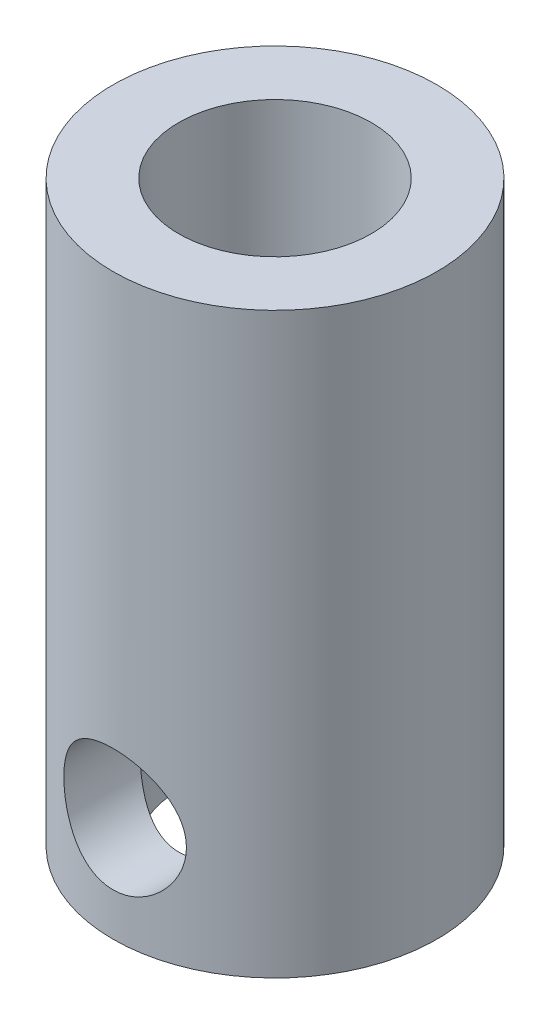
ISO-10303-21;
HEADER;
FILE_DESCRIPTION(('STEP AP214'),'2;1');
FILE_NAME('part.step','',(''),(''),'','','');
FILE_SCHEMA(('AUTOMOTIVE_DESIGN { 1 0 10303 214 1 1 1 1 }'));
ENDSEC;
DATA;
#1=APPLICATION_CONTEXT('core data for automotive mechanical design processes');
#2=APPLICATION_PROTOCOL_DEFINITION('international standard','automotive_design',2000,#1);
#3=PRODUCT_CONTEXT('',#1,'mechanical');
#4=PRODUCT('Part','Part','',(#3));
#5=PRODUCT_RELATED_PRODUCT_CATEGORY('part','',(#4));
#6=PRODUCT_DEFINITION_FORMATION('','',#4);
#7=PRODUCT_DEFINITION_CONTEXT('part definition',#1,'design');
#8=PRODUCT_DEFINITION('design','',#6,#7);
#9=PRODUCT_DEFINITION_SHAPE('','',#8);
#10=(LENGTH_UNIT() NAMED_UNIT(*) SI_UNIT(.MILLI.,.METRE.));
#11=(NAMED_UNIT(*) PLANE_ANGLE_UNIT() SI_UNIT($,.RADIAN.));
#12=(NAMED_UNIT(*) SI_UNIT($,.STERADIAN.) SOLID_ANGLE_UNIT());
#13=UNCERTAINTY_MEASURE_WITH_UNIT(LENGTH_MEASURE(1.E-05),#10,'distance_accuracy_value','');
#14=(GEOMETRIC_REPRESENTATION_CONTEXT(3) GLOBAL_UNCERTAINTY_ASSIGNED_CONTEXT((#13)) GLOBAL_UNIT_ASSIGNED_CONTEXT((#10,
#11,#12)) REPRESENTATION_CONTEXT('',''));
#15=CARTESIAN_POINT('',(0.,0.,0.));
#16=DIRECTION('',(0.,0.,1.));
#17=DIRECTION('',(1.,0.,0.));
#18=AXIS2_PLACEMENT_3D('',#15,#16,#17);
#19=CARTESIAN_POINT('',(0.,19.05,0.));
#20=DIRECTION('',(0.,-1.,0.));
#21=DIRECTION('',(0.,0.,-1.));
#22=AXIS2_PLACEMENT_3D('',#19,#20,#21);
#23=CYLINDRICAL_SURFACE('',#22,5.334);
#24=CARTESIAN_POINT('',(2.01929999999999,3.429,4.93700146951568));
#25=CARTESIAN_POINT('',(2.01930447944565,3.53796644205671,4.93699724405046));
#26=CARTESIAN_POINT('',(2.01045059439056,3.64690370553361,4.94064814854933));
#27=CARTESIAN_POINT('',(1.97543444054489,3.86148882864372,4.95475201963925));
#28=CARTESIAN_POINT('',(1.94927294682313,3.96713683535452,4.96520468163385));
#29=CARTESIAN_POINT('',(1.88074304619809,4.17198278347489,4.99156194094386));
#30=CARTESIAN_POINT('',(1.83841414033231,4.2711957615293,5.00745324054417));
#31=CARTESIAN_POINT('',(1.73889128334471,4.46115102344321,5.04287560500619));
#32=CARTESIAN_POINT('',(1.6816927775262,4.55189070025616,5.06240778458365));
#33=CARTESIAN_POINT('',(1.55095007886271,4.7269220295397,5.1040199433203));
#34=CARTESIAN_POINT('',(1.47677408325426,4.81072382075372,5.12617585427608));
#35=CARTESIAN_POINT('',(1.31552180232293,4.96504478705856,5.16990629793248));
#36=CARTESIAN_POINT('',(1.22844270450761,5.0355610586704,5.19148070266726));
#37=CARTESIAN_POINT('',(1.04012523794396,5.16368183766763,5.23252204526852));
#38=CARTESIAN_POINT('',(0.938499803257828,5.22075210244006,5.25188961400418));
#39=CARTESIAN_POINT('',(0.726227423158126,5.31678227445568,5.28542063488425));
#40=CARTESIAN_POINT('',(0.615583687488662,5.35574859235797,5.29958592879611));
#41=CARTESIAN_POINT('',(0.393566749542693,5.41274137724498,5.32057718322424));
#42=CARTESIAN_POINT('',(0.282438553669896,5.43161158643117,5.32769789450095));
#43=CARTESIAN_POINT('',(0.0583798398278732,5.45058184692518,5.33485652895422));
#44=CARTESIAN_POINT('',(-0.0545500684528995,5.45068811853213,5.33489679931724));
#45=CARTESIAN_POINT('',(-0.272951762873949,5.43261481136873,5.32807636219454));
#46=CARTESIAN_POINT('',(-0.378512558081566,5.41535666378981,5.32156339727964));
#47=CARTESIAN_POINT('',(-0.585111251091155,5.36459681820008,5.30282614548131));
#48=CARTESIAN_POINT('',(-0.686148827388547,5.33109396753274,5.29060145331974));
#49=CARTESIAN_POINT('',(-0.882591199788239,5.24837714092317,5.26142589156488));
#50=CARTESIAN_POINT('',(-0.977891853376849,5.19894029486581,5.24440843901689));
#51=CARTESIAN_POINT('',(-1.15908281530852,5.08595760716204,5.20736477295068));
#52=CARTESIAN_POINT('',(-1.24497004337341,5.02240716770396,5.18733757963256));
#53=CARTESIAN_POINT('',(-1.41031734945089,4.87858128309122,5.14492730665769));
#54=CARTESIAN_POINT('',(-1.48909060289719,4.79753549367529,5.12247495361345));
#55=CARTESIAN_POINT('',(-1.63218972233639,4.62325577623301,5.07869327063848));
#56=CARTESIAN_POINT('',(-1.69651181554814,4.53001867543433,5.05736423508365));
#57=CARTESIAN_POINT('',(-1.81023010786301,4.33124303399592,5.01780263958016));
#58=CARTESIAN_POINT('',(-1.85924901990288,4.22547089829707,4.99965257367589));
#59=CARTESIAN_POINT('',(-1.93851753880741,4.00630460921826,4.96945937974622));
#60=CARTESIAN_POINT('',(-1.96877783080307,3.89291483581017,4.95741277583277));
#61=CARTESIAN_POINT('',(-2.0080927254921,3.66852916571396,4.94161372576153));
#62=CARTESIAN_POINT('',(-2.01824049485177,3.55775511724918,4.93743437273379));
#63=CARTESIAN_POINT('',(-2.02020093934924,3.33603239846786,4.93663342024542));
#64=CARTESIAN_POINT('',(-2.01201832383527,3.22508378031911,4.94000987958409));
#65=CARTESIAN_POINT('',(-1.97854205652086,3.01183186914766,4.95350589275915));
#66=CARTESIAN_POINT('',(-1.95410194104481,2.90937078397479,4.96328872527596));
#67=CARTESIAN_POINT('',(-1.88988298600506,2.71005348440488,4.98809328378995));
#68=CARTESIAN_POINT('',(-1.85010096750629,2.61319843639933,5.00311609548081));
#69=CARTESIAN_POINT('',(-1.75463072385412,2.42375373533398,5.03740860205377));
#70=CARTESIAN_POINT('',(-1.69839621410485,2.3314653892027,5.05681781536739));
#71=CARTESIAN_POINT('',(-1.57219523321136,2.15724747101338,5.09746480725639));
#72=CARTESIAN_POINT('',(-1.50222365366067,2.07532177120689,5.11870326441882));
#73=CARTESIAN_POINT('',(-1.34516894631352,1.91864380219287,5.16227937258415));
#74=CARTESIAN_POINT('',(-1.25727058071108,1.84470087388889,5.18459902436317));
#75=CARTESIAN_POINT('',(-1.06976739053702,1.71251372859965,5.22650650196036));
#76=CARTESIAN_POINT('',(-0.970162473418255,1.65426963573486,5.24609430617899));
#77=CARTESIAN_POINT('',(-0.762084546055994,1.55549649159357,5.28032694944767));
#78=CARTESIAN_POINT('',(-0.653639678197281,1.51491364331945,5.29498676788628));
#79=CARTESIAN_POINT('',(-0.430779322695875,1.45280032542776,5.31775366325145));
#80=CARTESIAN_POINT('',(-0.316366729446474,1.43126070903253,5.32586388589443));
#81=CARTESIAN_POINT('',(-0.0921269840688139,1.40884562792458,5.33431446661301));
#82=CARTESIAN_POINT('',(0.0175700260696672,1.40682107157147,5.33508685186249));
#83=CARTESIAN_POINT('',(0.235675890355791,1.42052681410102,5.32990684279753));
#84=CARTESIAN_POINT('',(0.344084903230242,1.43625490180729,5.32395528598201));
#85=CARTESIAN_POINT('',(0.553754325491232,1.48421010250464,5.3061959436016));
#86=CARTESIAN_POINT('',(0.65512610504446,1.5160107376975,5.29453976881732));
#87=CARTESIAN_POINT('',(0.851099804673821,1.594780504935,5.26659215506921));
#88=CARTESIAN_POINT('',(0.945700438435498,1.64175250979098,5.2502998382871));
#89=CARTESIAN_POINT('',(1.12984126460486,1.75179421046231,5.21384686801513));
#90=CARTESIAN_POINT('',(1.21899691290268,1.81546192263802,5.19355150342232));
#91=CARTESIAN_POINT('',(1.38571137675006,1.9561510808879,5.15157869080139));
#92=CARTESIAN_POINT('',(1.46326600313846,2.03317732918966,5.1299007475314));
#93=CARTESIAN_POINT('',(1.60889417238222,2.20334295835456,5.08616858438968));
#94=CARTESIAN_POINT('',(1.67622898493519,2.29712810269221,5.06415732477682));
#95=CARTESIAN_POINT('',(1.79422016325732,2.49537615296483,5.02356822261871));
#96=CARTESIAN_POINT('',(1.84487417660335,2.59984056223187,5.0049908645041));
#97=CARTESIAN_POINT('',(1.92989734602869,2.82239312636753,4.97285117373348));
#98=CARTESIAN_POINT('',(1.96328114135574,2.94090744590317,4.9596003647767));
#99=CARTESIAN_POINT('',(2.00797225124147,3.18262915575414,4.94168088836879));
#100=CARTESIAN_POINT('',(2.01929493679981,3.30583321744351,4.93700624563709));
#101=CARTESIAN_POINT('',(2.01929999999999,3.429,4.93700146951568));
#102=B_SPLINE_CURVE_WITH_KNOTS('',3,(#24,#25,#26,#27,#28,#29,#30,#31,#32,#33,#34,#35,#36,#37,
#38,#39,#40,#41,#42,#43,#44,#45,#46,#47,#48,#49,#50,#51,#52,#53,#54,#55,#56,#57,#58,#59,#60,#61,
#62,#63,#64,#65,#66,#67,#68,#69,#70,#71,#72,#73,#74,#75,#76,#77,#78,#79,#80,#81,#82,#83,#84,#85,
#86,#87,#88,#89,#90,#91,#92,#93,#94,#95,#96,#97,#98,#99,#100,#101),.UNSPECIFIED.,.T.,.F.,(4,2,2,
2,2,2,2,2,2,2,2,2,2,2,2,2,2,2,2,2,2,2,2,2,2,2,2,2,2,2,2,2,2,2,2,2,2,2,4),(0.,0.326440462933104,
0.652866308208239,0.97849966296616,1.30423288001533,1.64497726295524,1.98579602758814,
2.33846601182069,2.69101101924979,3.02808777213957,3.36505278290879,3.68503301877184,
4.00503596242417,4.32972461584071,4.65451919925019,4.99864582719999,5.34286219255829,
5.69499486283584,6.0469267694459,6.37913973630183,6.71126736249901,7.02720512429604,
7.34320838551137,7.6712024554679,7.99931872846167,8.3487060328166,8.69809609946859,
9.04641432838319,9.39456516328478,9.72208120206034,10.0495564516543,10.3687657960398,
10.6880356205532,11.0208403418839,11.3537649513074,11.7046787209908,12.0556419573988,
12.4248810015916,12.793862687667),.UNSPECIFIED.);
#103=CARTESIAN_POINT('',(2.01929999999999,3.429,4.93700146951568));
#104=VERTEX_POINT('',#103);
#105=EDGE_CURVE('E52',#104,#104,#102,.T.);
#106=ORIENTED_EDGE('',*,*,#105,.F.);
#107=EDGE_LOOP('',(#106));
#108=FACE_BOUND('',#107,.T.);
#109=CARTESIAN_POINT('',(0.,19.05,0.));
#110=DIRECTION('',(0.,-1.,0.));
#111=DIRECTION('',(0.,0.,-1.));
#112=AXIS2_PLACEMENT_3D('',#109,#110,#111);
#113=CIRCLE('',#112,5.334);
#114=CARTESIAN_POINT('',(0.,19.05,-5.334));
#115=VERTEX_POINT('',#114);
#116=EDGE_CURVE('E10',#115,#115,#113,.T.);
#117=ORIENTED_EDGE('',*,*,#116,.T.);
#118=EDGE_LOOP('',(#117));
#119=FACE_BOUND('',#118,.T.);
#120=CARTESIAN_POINT('',(0.,0.,0.));
#121=DIRECTION('',(0.,-1.,0.));
#122=DIRECTION('',(0.,0.,-1.));
#123=AXIS2_PLACEMENT_3D('',#120,#121,#122);
#124=CIRCLE('',#123,5.334);
#125=CARTESIAN_POINT('',(0.,0.,-5.334));
#126=VERTEX_POINT('',#125);
#127=EDGE_CURVE('E39',#126,#126,#124,.T.);
#128=ORIENTED_EDGE('',*,*,#127,.F.);
#129=EDGE_LOOP('',(#128));
#130=FACE_BOUND('',#129,.T.);
#131=ADVANCED_FACE('F32',(#108,#119,#130),#23,.T.);
#132=CARTESIAN_POINT('',(5.334,19.05,0.));
#133=DIRECTION('',(0.,1.,0.));
#134=DIRECTION('',(0.,0.,1.));
#135=AXIS2_PLACEMENT_3D('',#132,#133,#134);
#136=PLANE('',#135);
#137=CARTESIAN_POINT('',(0.,19.05,0.));
#138=DIRECTION('',(0.,-1.,0.));
#139=DIRECTION('',(0.,0.,-1.));
#140=AXIS2_PLACEMENT_3D('',#137,#138,#139);
#141=CIRCLE('',#140,3.17499999999998);
#142=CARTESIAN_POINT('',(0.,19.05,-3.17499999999998));
#143=VERTEX_POINT('',#142);
#144=EDGE_CURVE('E43',#143,#143,#141,.T.);
#145=ORIENTED_EDGE('',*,*,#144,.T.);
#146=EDGE_LOOP('',(#145));
#147=FACE_BOUND('',#146,.T.);
#148=ORIENTED_EDGE('',*,*,#116,.F.);
#149=EDGE_LOOP('',(#148));
#150=FACE_BOUND('',#149,.T.);
#151=ADVANCED_FACE('F77',(#147,#150),#136,.T.);
#152=CARTESIAN_POINT('',(0.,0.,0.));
#153=DIRECTION('',(0.,-1.,0.));
#154=DIRECTION('',(0.,0.,-1.));
#155=AXIS2_PLACEMENT_3D('',#152,#153,#154);
#156=PLANE('',#155);
#157=CARTESIAN_POINT('',(0.,0.,0.));
#158=DIRECTION('',(0.,-1.,0.));
#159=DIRECTION('',(0.,0.,-1.));
#160=AXIS2_PLACEMENT_3D('',#157,#158,#159);
#161=CIRCLE('',#160,3.17499999999998);
#162=CARTESIAN_POINT('',(0.,0.,-3.17499999999998));
#163=VERTEX_POINT('',#162);
#164=EDGE_CURVE('E47',#163,#163,#161,.T.);
#165=ORIENTED_EDGE('',*,*,#164,.F.);
#166=EDGE_LOOP('',(#165));
#167=FACE_BOUND('',#166,.T.);
#168=ORIENTED_EDGE('',*,*,#127,.T.);
#169=EDGE_LOOP('',(#168));
#170=FACE_BOUND('',#169,.T.);
#171=ADVANCED_FACE('F74',(#167,#170),#156,.T.);
#172=CARTESIAN_POINT('',(0.,0.,0.));
#173=DIRECTION('',(0.,-1.,0.));
#174=DIRECTION('',(0.,0.,-1.));
#175=AXIS2_PLACEMENT_3D('',#172,#173,#174);
#176=CYLINDRICAL_SURFACE('',#175,3.17499999999998);
#177=CARTESIAN_POINT('',(2.01929999999999,3.429,2.45011275454823));
#178=CARTESIAN_POINT('',(2.01929051569735,3.52894127069753,2.4501281795155));
#179=CARTESIAN_POINT('',(2.01181623998909,3.628972329925,2.45634010720794));
#180=CARTESIAN_POINT('',(1.98248167673375,3.82557968147831,2.48006385016955));
#181=CARTESIAN_POINT('',(1.96059293748517,3.92214874208904,2.49759801227126));
#182=CARTESIAN_POINT('',(1.9040331603516,4.10843627589821,2.54096978697849));
#183=CARTESIAN_POINT('',(1.86947367457506,4.19820652404967,2.56673468951971));
#184=CARTESIAN_POINT('',(1.78888009345359,4.37056455142342,2.6235396487539));
#185=CARTESIAN_POINT('',(1.74284368975069,4.45315088122778,2.65458076625438));
#186=CARTESIAN_POINT('',(1.63312725242593,4.6214415102559,2.72365220953029));
#187=CARTESIAN_POINT('',(1.56788172310624,4.7059732450019,2.76205343085874));
#188=CARTESIAN_POINT('',(1.42479045231801,4.86389017756889,2.83851915466697));
#189=CARTESIAN_POINT('',(1.34693386567764,4.93726567508319,2.87658333731986));
#190=CARTESIAN_POINT('',(1.16891001207363,5.08000661538207,2.95378200389085));
#191=CARTESIAN_POINT('',(1.06716606271611,5.14768834305823,2.99244190742992));
#192=CARTESIAN_POINT('',(0.850805271225739,5.26441857889044,3.06097746101503));
#193=CARTESIAN_POINT('',(0.736201684957568,5.31348605031166,3.09086204386164));
#194=CARTESIAN_POINT('',(0.509994904354269,5.38605734525045,3.13566626418311));
#195=CARTESIAN_POINT('',(0.399328091275863,5.41169558748184,3.15182273437586));
#196=CARTESIAN_POINT('',(0.174221138396403,5.44397014691782,3.17222196724826));
#197=CARTESIAN_POINT('',(0.0597853025568782,5.45062742668431,3.17647787280314));
#198=CARTESIAN_POINT('',(-0.15242412758129,5.44493994541017,3.17286513938982));
#199=CARTESIAN_POINT('',(-0.250305470554214,5.43510476842585,3.16659762255067));
#200=CARTESIAN_POINT('',(-0.442698018208734,5.40159302412571,3.14547384128326));
#201=CARTESIAN_POINT('',(-0.537208968983373,5.37791541632401,3.13061693122204));
#202=CARTESIAN_POINT('',(-0.720612526879302,5.31781504253609,3.09356053401836));
#203=CARTESIAN_POINT('',(-0.809499492488895,5.2813797110953,3.07135380901374));
#204=CARTESIAN_POINT('',(-0.97994873920657,5.19714027782338,3.02129545312326));
#205=CARTESIAN_POINT('',(-1.06150944275225,5.14933373547795,2.99344261064513));
#206=CARTESIAN_POINT('',(-1.22606234754406,5.03694609088178,2.93020696894431));
#207=CARTESIAN_POINT('',(-1.30793132368399,4.97100822513682,2.89431735966662));
#208=CARTESIAN_POINT('',(-1.4601602295923,4.82773303530302,2.82059026986523));
#209=CARTESIAN_POINT('',(-1.53050270668808,4.75037875571948,2.78274994751953));
#210=CARTESIAN_POINT('',(-1.6675094809994,4.57403891610957,2.70316998021407));
#211=CARTESIAN_POINT('',(-1.73234677283065,4.47354168042348,2.66160715287757));
#212=CARTESIAN_POINT('',(-1.84401294040444,4.26060899617821,2.58550168350824));
#213=CARTESIAN_POINT('',(-1.89087460028104,4.14819576286591,2.55094631600007));
#214=CARTESIAN_POINT('',(-1.95422417089592,3.94536060127733,2.50255370083122));
#215=CARTESIAN_POINT('',(-1.97549340596571,3.85717038933683,2.48564302359111));
#216=CARTESIAN_POINT('',(-2.00601072185794,3.67752371563982,2.46108567735711));
#217=CARTESIAN_POINT('',(-2.01527635522342,3.58607222444306,2.45342548274735));
#218=CARTESIAN_POINT('',(-2.02122148552107,3.40221667144573,2.44853180042153));
#219=CARTESIAN_POINT('',(-2.01786621047328,3.30981067847947,2.45132711866523));
#220=CARTESIAN_POINT('',(-1.9987248225326,3.12713534005661,2.46695474139762));
#221=CARTESIAN_POINT('',(-1.98292831962279,3.03686784545298,2.47979543499969));
#222=CARTESIAN_POINT('',(-1.94035603763407,2.86293908196718,2.51323380479192));
#223=CARTESIAN_POINT('',(-1.91385485991129,2.77917087309288,2.53363649039044));
#224=CARTESIAN_POINT('',(-1.85093711433129,2.61710707475903,2.57995729521186));
#225=CARTESIAN_POINT('',(-1.8145172353892,2.53881332378447,2.60587725559255));
#226=CARTESIAN_POINT('',(-1.72468862869318,2.37378481532053,2.66637185156352));
#227=CARTESIAN_POINT('',(-1.66935511652756,2.28835645675552,2.70165014338978));
#228=CARTESIAN_POINT('',(-1.54684224267733,2.12702926072513,2.7736192169777));
#229=CARTESIAN_POINT('',(-1.47964890187628,2.05114185189079,2.81031162521155));
#230=CARTESIAN_POINT('',(-1.32146957597982,1.89750442417588,2.88849831537439));
#231=CARTESIAN_POINT('',(-1.22837765550165,1.82175420866532,2.92970866402263));
#232=CARTESIAN_POINT('',(-1.02843925094223,1.68705670958564,3.00571697609958));
#233=CARTESIAN_POINT('',(-0.921608355915269,1.62809062174494,3.04052210010587));
#234=CARTESIAN_POINT('',(-0.71921629970114,1.53957226245438,3.09386715213229));
#235=CARTESIAN_POINT('',(-0.625687670231281,1.50649343239506,3.11426889307066));
#236=CARTESIAN_POINT('',(-0.433449506453154,1.45426158788784,3.14677961976784));
#237=CARTESIAN_POINT('',(-0.334744157744082,1.43509750336512,3.15889519725592));
#238=CARTESIAN_POINT('',(-0.13454985804508,1.4116616455388,3.17373957805949));
#239=CARTESIAN_POINT('',(-0.0330532251289144,1.4074362316746,3.17643916020348));
#240=CARTESIAN_POINT('',(0.169220717606877,1.41425996732008,3.17210070452943));
#241=CARTESIAN_POINT('',(0.26999795874247,1.42531055621006,3.16506174909831));
#242=CARTESIAN_POINT('',(0.462903169338648,1.46114457582786,3.14250337260814));
#243=CARTESIAN_POINT('',(0.555213410179449,1.48523382787444,3.1274131373522));
#244=CARTESIAN_POINT('',(0.734262324128178,1.54555540013465,3.09028356911827));
#245=CARTESIAN_POINT('',(0.821000087055449,1.58178969808063,3.0682431043806));
#246=CARTESIAN_POINT('',(0.993896475754055,1.66837247564593,3.0168778146115));
#247=CARTESIAN_POINT('',(1.07948239570685,1.71960130435253,2.98711895257935));
#248=CARTESIAN_POINT('',(1.24128256073287,1.83319976081679,2.92359589755361));
#249=CARTESIAN_POINT('',(1.31748906326208,1.89557848984222,2.8898284401059));
#250=CARTESIAN_POINT('',(1.47048578378874,2.04048577966153,2.81541804007872));
#251=CARTESIAN_POINT('',(1.54561455035014,2.1246353506411,2.77450861601169));
#252=CARTESIAN_POINT('',(1.68123983029398,2.30484642528026,2.69448679509776));
#253=CARTESIAN_POINT('',(1.74173279611849,2.40091080844166,2.6553748357939));
#254=CARTESIAN_POINT('',(1.83876550837131,2.58877299516955,2.58891897326559));
#255=CARTESIAN_POINT('',(1.87752281278316,2.67910791563853,2.56069019061927));
#256=CARTESIAN_POINT('',(1.94182185539047,2.866300549675,2.51228784962041));
#257=CARTESIAN_POINT('',(1.96739877665448,2.96314010978249,2.49209287945081));
#258=CARTESIAN_POINT('',(1.99678820017445,3.12216120028776,2.46853356270054));
#259=CARTESIAN_POINT('',(2.00520384926546,3.18300506264096,2.46167383937579));
#260=CARTESIAN_POINT('',(2.01646293280567,3.30555447596037,2.45245846542434));
#261=CARTESIAN_POINT('',(2.01930585903946,3.36726010500031,2.45010322559334));
#262=CARTESIAN_POINT('',(2.01929999999999,3.429,2.45011275454823));
#263=B_SPLINE_CURVE_WITH_KNOTS('',3,(#177,#178,#179,#180,#181,#182,#183,#184,#185,#186,#187,
#188,#189,#190,#191,#192,#193,#194,#195,#196,#197,#198,#199,#200,#201,#202,#203,#204,#205,#206,
#207,#208,#209,#210,#211,#212,#213,#214,#215,#216,#217,#218,#219,#220,#221,#222,#223,#224,#225,
#226,#227,#228,#229,#230,#231,#232,#233,#234,#235,#236,#237,#238,#239,#240,#241,#242,#243,#244,
#245,#246,#247,#248,#249,#250,#251,#252,#253,#254,#255,#256,#257,#258,#259,#260,#261,#262),
.UNSPECIFIED.,.T.,.F.,(4,2,2,2,2,2,2,2,2,2,2,2,2,2,2,2,2,2,2,2,2,2,2,2,2,2,2,2,2,2,2,2,2,2,2,2,
2,2,2,2,2,2,4),(0.,0.299545346163703,0.599683723262749,0.897240786031993,1.19485774494705,
1.53399780499747,1.87343108015558,2.25583678812834,2.63785186753817,2.97997514749979,
3.32172044011374,3.61602438944011,3.91035046338391,4.20496724691205,4.49964731888725,
4.831591447703,5.16403363102356,5.54206146658146,5.9193965355226,6.19510071677626,
6.47040128648608,6.74646089414033,7.02275129165824,7.29236365357902,7.56206612870595,
7.88405755850047,8.20643108372256,8.58524226804168,8.9636273616455,9.26617640041807,
9.56848447745551,9.87172989295244,10.175003883675,10.4635252097641,10.7520935422965,
11.0631665349708,11.37449461478,11.7329995987663,12.0915913935741,12.3972580961101,
12.7021045844746,12.887135370411,13.0721830298085),.UNSPECIFIED.);
#264=CARTESIAN_POINT('',(2.01929999999999,3.429,2.45011275454823));
#265=VERTEX_POINT('',#264);
#266=EDGE_CURVE('E59',#265,#265,#263,.T.);
#267=ORIENTED_EDGE('',*,*,#266,.T.);
#268=EDGE_LOOP('',(#267));
#269=FACE_BOUND('',#268,.T.);
#270=ORIENTED_EDGE('',*,*,#144,.F.);
#271=EDGE_LOOP('',(#270));
#272=FACE_BOUND('',#271,.T.);
#273=ORIENTED_EDGE('',*,*,#164,.T.);
#274=EDGE_LOOP('',(#273));
#275=FACE_BOUND('',#274,.T.);
#276=ADVANCED_FACE('F67',(#269,#272,#275),#176,.F.);
#277=CARTESIAN_POINT('',(0.,3.429,5.334));
#278=DIRECTION('',(0.,0.,1.));
#279=DIRECTION('',(1.,0.,0.));
#280=AXIS2_PLACEMENT_3D('',#277,#278,#279);
#281=CYLINDRICAL_SURFACE('',#280,2.01929999999999);
#282=ORIENTED_EDGE('',*,*,#105,.T.);
#283=EDGE_LOOP('',(#282));
#284=FACE_BOUND('',#283,.T.);
#285=ORIENTED_EDGE('',*,*,#266,.F.);
#286=EDGE_LOOP('',(#285));
#287=FACE_BOUND('',#286,.T.);
#288=ADVANCED_FACE('F64',(#284,#287),#281,.F.);
#289=CLOSED_SHELL('',(#131,#151,#171,#276,#288));
#290=MANIFOLD_SOLID_BREP('B2',#289);
#291=ADVANCED_BREP_SHAPE_REPRESENTATION('',(#18,#290),#14);
#292=SHAPE_DEFINITION_REPRESENTATION(#9,#291);
ENDSEC;
END-ISO-10303-21;
